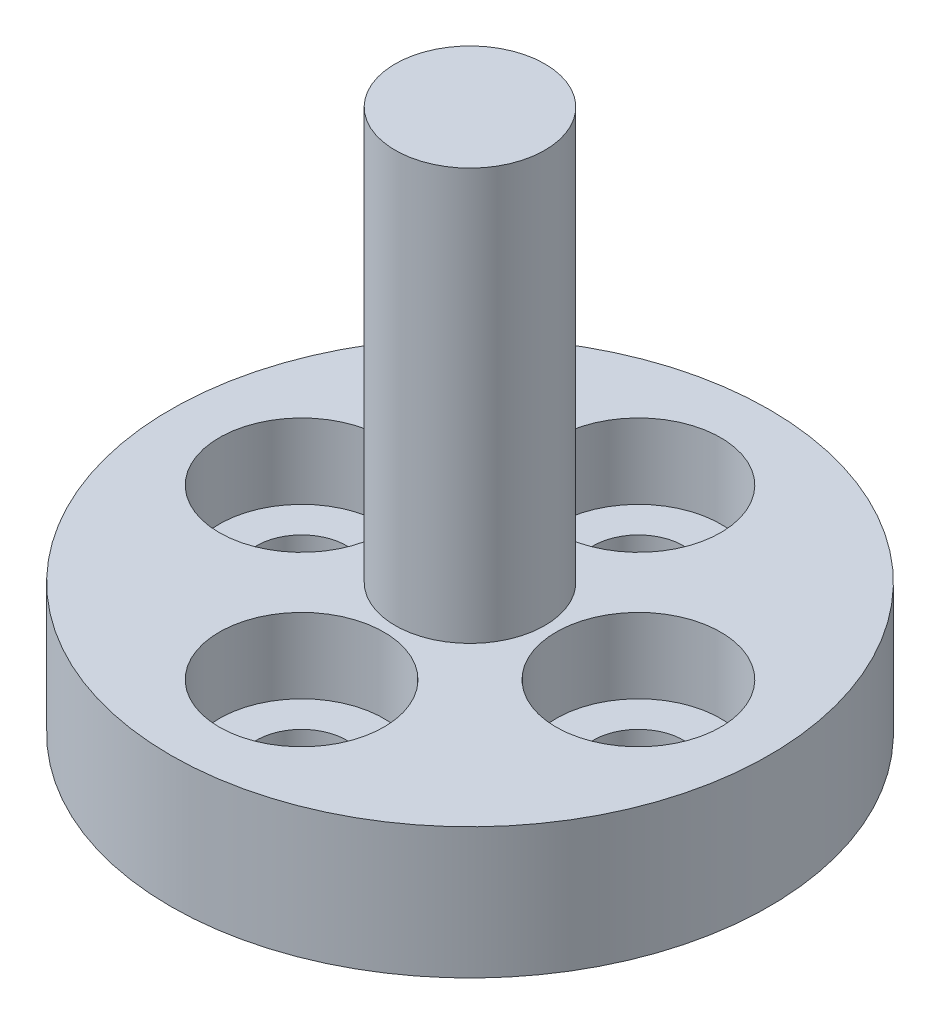
ISO-10303-21;
HEADER;
FILE_DESCRIPTION(('STEP AP214'),'2;1');
FILE_NAME('part.step','',(''),(''),'','','');
FILE_SCHEMA(('AUTOMOTIVE_DESIGN { 1 0 10303 214 1 1 1 1 }'));
ENDSEC;
DATA;
#1=APPLICATION_CONTEXT('core data for automotive mechanical design processes');
#2=APPLICATION_PROTOCOL_DEFINITION('international standard','automotive_design',2000,#1);
#3=PRODUCT_CONTEXT('',#1,'mechanical');
#4=PRODUCT('Part','Part','',(#3));
#5=PRODUCT_RELATED_PRODUCT_CATEGORY('part','',(#4));
#6=PRODUCT_DEFINITION_FORMATION('','',#4);
#7=PRODUCT_DEFINITION_CONTEXT('part definition',#1,'design');
#8=PRODUCT_DEFINITION('design','',#6,#7);
#9=PRODUCT_DEFINITION_SHAPE('','',#8);
#10=(LENGTH_UNIT() NAMED_UNIT(*) SI_UNIT(.MILLI.,.METRE.));
#11=(NAMED_UNIT(*) PLANE_ANGLE_UNIT() SI_UNIT($,.RADIAN.));
#12=(NAMED_UNIT(*) SI_UNIT($,.STERADIAN.) SOLID_ANGLE_UNIT());
#13=UNCERTAINTY_MEASURE_WITH_UNIT(LENGTH_MEASURE(1.E-05),#10,'distance_accuracy_value','');
#14=(GEOMETRIC_REPRESENTATION_CONTEXT(3) GLOBAL_UNCERTAINTY_ASSIGNED_CONTEXT((#13)) GLOBAL_UNIT_ASSIGNED_CONTEXT((#10,
#11,#12)) REPRESENTATION_CONTEXT('',''));
#15=CARTESIAN_POINT('',(0.,0.,0.));
#16=DIRECTION('',(0.,0.,1.));
#17=DIRECTION('',(1.,0.,0.));
#18=AXIS2_PLACEMENT_3D('',#15,#16,#17);
#19=CARTESIAN_POINT('',(8.,0.,0.));
#20=DIRECTION('',(0.,-1.,0.));
#21=DIRECTION('',(0.,0.,-1.));
#22=AXIS2_PLACEMENT_3D('',#19,#20,#21);
#23=PLANE('',#22);
#24=CARTESIAN_POINT('',(0.,0.,4.5));
#25=DIRECTION('',(0.,-1.,0.));
#26=DIRECTION('',(0.,0.,-1.));
#27=AXIS2_PLACEMENT_3D('',#24,#25,#26);
#28=CIRCLE('',#27,1.2);
#29=CARTESIAN_POINT('',(0.,0.,3.3));
#30=VERTEX_POINT('',#29);
#31=EDGE_CURVE('E39',#30,#30,#28,.T.);
#32=ORIENTED_EDGE('',*,*,#31,.F.);
#33=EDGE_LOOP('',(#32));
#34=FACE_BOUND('',#33,.T.);
#35=CARTESIAN_POINT('',(4.5,0.,0.));
#36=DIRECTION('',(0.,-1.,0.));
#37=DIRECTION('',(0.,0.,-1.));
#38=AXIS2_PLACEMENT_3D('',#35,#36,#37);
#39=CIRCLE('',#38,1.2);
#40=CARTESIAN_POINT('',(4.5,0.,-1.2));
#41=VERTEX_POINT('',#40);
#42=EDGE_CURVE('E65',#41,#41,#39,.T.);
#43=ORIENTED_EDGE('',*,*,#42,.F.);
#44=EDGE_LOOP('',(#43));
#45=FACE_BOUND('',#44,.T.);
#46=CARTESIAN_POINT('',(0.,0.,-4.5));
#47=DIRECTION('',(0.,-1.,0.));
#48=DIRECTION('',(0.,0.,-1.));
#49=AXIS2_PLACEMENT_3D('',#46,#47,#48);
#50=CIRCLE('',#49,1.2);
#51=CARTESIAN_POINT('',(0.,0.,-5.7));
#52=VERTEX_POINT('',#51);
#53=EDGE_CURVE('E60',#52,#52,#50,.T.);
#54=ORIENTED_EDGE('',*,*,#53,.F.);
#55=EDGE_LOOP('',(#54));
#56=FACE_BOUND('',#55,.T.);
#57=CARTESIAN_POINT('',(-4.5,0.,0.));
#58=DIRECTION('',(0.,-1.,0.));
#59=DIRECTION('',(0.,0.,-1.));
#60=AXIS2_PLACEMENT_3D('',#57,#58,#59);
#61=CIRCLE('',#60,1.2);
#62=CARTESIAN_POINT('',(-4.5,0.,-1.2));
#63=VERTEX_POINT('',#62);
#64=EDGE_CURVE('E54',#63,#63,#61,.T.);
#65=ORIENTED_EDGE('',*,*,#64,.F.);
#66=EDGE_LOOP('',(#65));
#67=FACE_BOUND('',#66,.T.);
#68=CARTESIAN_POINT('',(0.,0.,0.));
#69=DIRECTION('',(0.,-1.,0.));
#70=DIRECTION('',(0.,0.,-1.));
#71=AXIS2_PLACEMENT_3D('',#68,#69,#70);
#72=CIRCLE('',#71,8.);
#73=CARTESIAN_POINT('',(0.,0.,-8.));
#74=VERTEX_POINT('',#73);
#75=EDGE_CURVE('E58',#74,#74,#72,.T.);
#76=ORIENTED_EDGE('',*,*,#75,.T.);
#77=EDGE_LOOP('',(#76));
#78=FACE_BOUND('',#77,.T.);
#79=ADVANCED_FACE('F36',(#34,#45,#56,#67,#78),#23,.T.);
#80=CARTESIAN_POINT('',(0.,14.5,0.));
#81=DIRECTION('',(0.,1.,0.));
#82=DIRECTION('',(0.,0.,1.));
#83=AXIS2_PLACEMENT_3D('',#80,#81,#82);
#84=PLANE('',#83);
#85=CARTESIAN_POINT('',(0.,14.5,0.));
#86=DIRECTION('',(0.,-1.,0.));
#87=DIRECTION('',(0.,0.,-1.));
#88=AXIS2_PLACEMENT_3D('',#85,#86,#87);
#89=CIRCLE('',#88,2.);
#90=CARTESIAN_POINT('',(0.,14.5,-2.));
#91=VERTEX_POINT('',#90);
#92=EDGE_CURVE('E10',#91,#91,#89,.T.);
#93=ORIENTED_EDGE('',*,*,#92,.F.);
#94=EDGE_LOOP('',(#93));
#95=FACE_BOUND('',#94,.T.);
#96=ADVANCED_FACE('F124',(#95),#84,.T.);
#97=CARTESIAN_POINT('',(0.,0.,0.));
#98=DIRECTION('',(0.,-1.,0.));
#99=DIRECTION('',(0.,0.,-1.));
#100=AXIS2_PLACEMENT_3D('',#97,#98,#99);
#101=CYLINDRICAL_SURFACE('',#100,2.);
#102=ORIENTED_EDGE('',*,*,#92,.T.);
#103=EDGE_LOOP('',(#102));
#104=FACE_BOUND('',#103,.T.);
#105=CARTESIAN_POINT('',(0.,3.5,0.));
#106=DIRECTION('',(0.,-1.,0.));
#107=DIRECTION('',(0.,0.,-1.));
#108=AXIS2_PLACEMENT_3D('',#105,#106,#107);
#109=CIRCLE('',#108,2.);
#110=CARTESIAN_POINT('',(0.,3.5,-2.));
#111=VERTEX_POINT('',#110);
#112=EDGE_CURVE('E44',#111,#111,#109,.T.);
#113=ORIENTED_EDGE('',*,*,#112,.F.);
#114=EDGE_LOOP('',(#113));
#115=FACE_BOUND('',#114,.T.);
#116=ADVANCED_FACE('F115',(#104,#115),#101,.T.);
#117=CARTESIAN_POINT('',(2.,3.5,0.));
#118=DIRECTION('',(0.,1.,0.));
#119=DIRECTION('',(0.,0.,1.));
#120=AXIS2_PLACEMENT_3D('',#117,#118,#119);
#121=PLANE('',#120);
#122=CARTESIAN_POINT('',(0.,3.5,4.5));
#123=DIRECTION('',(0.,1.,0.));
#124=DIRECTION('',(0.,0.,1.));
#125=AXIS2_PLACEMENT_3D('',#122,#123,#124);
#126=CIRCLE('',#125,2.2);
#127=CARTESIAN_POINT('',(0.,3.5,6.7));
#128=VERTEX_POINT('',#127);
#129=EDGE_CURVE('E208',#128,#128,#126,.T.);
#130=ORIENTED_EDGE('',*,*,#129,.F.);
#131=EDGE_LOOP('',(#130));
#132=FACE_BOUND('',#131,.T.);
#133=CARTESIAN_POINT('',(4.5,3.5,0.));
#134=DIRECTION('',(0.,1.,0.));
#135=DIRECTION('',(0.,0.,1.));
#136=AXIS2_PLACEMENT_3D('',#133,#134,#135);
#137=CIRCLE('',#136,2.2);
#138=CARTESIAN_POINT('',(4.5,3.5,2.2));
#139=VERTEX_POINT('',#138);
#140=EDGE_CURVE('E84',#139,#139,#137,.T.);
#141=ORIENTED_EDGE('',*,*,#140,.F.);
#142=EDGE_LOOP('',(#141));
#143=FACE_BOUND('',#142,.T.);
#144=CARTESIAN_POINT('',(0.,3.5,-4.5));
#145=DIRECTION('',(0.,1.,0.));
#146=DIRECTION('',(0.,0.,1.));
#147=AXIS2_PLACEMENT_3D('',#144,#145,#146);
#148=CIRCLE('',#147,2.2);
#149=CARTESIAN_POINT('',(0.,3.5,-2.3));
#150=VERTEX_POINT('',#149);
#151=EDGE_CURVE('E68',#150,#150,#148,.T.);
#152=ORIENTED_EDGE('',*,*,#151,.F.);
#153=EDGE_LOOP('',(#152));
#154=FACE_BOUND('',#153,.T.);
#155=CARTESIAN_POINT('',(-4.5,3.5,0.));
#156=DIRECTION('',(0.,1.,0.));
#157=DIRECTION('',(0.,0.,1.));
#158=AXIS2_PLACEMENT_3D('',#155,#156,#157);
#159=CIRCLE('',#158,2.2);
#160=CARTESIAN_POINT('',(-4.5,3.5,2.2));
#161=VERTEX_POINT('',#160);
#162=EDGE_CURVE('E63',#161,#161,#159,.T.);
#163=ORIENTED_EDGE('',*,*,#162,.F.);
#164=EDGE_LOOP('',(#163));
#165=FACE_BOUND('',#164,.T.);
#166=ORIENTED_EDGE('',*,*,#112,.T.);
#167=EDGE_LOOP('',(#166));
#168=FACE_BOUND('',#167,.T.);
#169=CARTESIAN_POINT('',(0.,3.5,0.));
#170=DIRECTION('',(0.,-1.,0.));
#171=DIRECTION('',(0.,0.,-1.));
#172=AXIS2_PLACEMENT_3D('',#169,#170,#171);
#173=CIRCLE('',#172,8.);
#174=CARTESIAN_POINT('',(0.,3.5,-8.));
#175=VERTEX_POINT('',#174);
#176=EDGE_CURVE('E50',#175,#175,#173,.T.);
#177=ORIENTED_EDGE('',*,*,#176,.F.);
#178=EDGE_LOOP('',(#177));
#179=FACE_BOUND('',#178,.T.);
#180=ADVANCED_FACE('F113',(#132,#143,#154,#165,#168,#179),#121,.T.);
#181=CARTESIAN_POINT('',(0.,0.,0.));
#182=DIRECTION('',(0.,-1.,0.));
#183=DIRECTION('',(0.,0.,-1.));
#184=AXIS2_PLACEMENT_3D('',#181,#182,#183);
#185=CYLINDRICAL_SURFACE('',#184,8.);
#186=ORIENTED_EDGE('',*,*,#176,.T.);
#187=EDGE_LOOP('',(#186));
#188=FACE_BOUND('',#187,.T.);
#189=ORIENTED_EDGE('',*,*,#75,.F.);
#190=EDGE_LOOP('',(#189));
#191=FACE_BOUND('',#190,.T.);
#192=ADVANCED_FACE('F110',(#188,#191),#185,.T.);
#193=CARTESIAN_POINT('',(-4.5,3.5,0.));
#194=DIRECTION('',(0.,1.,0.));
#195=DIRECTION('',(0.,0.,1.));
#196=AXIS2_PLACEMENT_3D('',#193,#194,#195);
#197=CYLINDRICAL_SURFACE('',#196,1.2);
#198=ORIENTED_EDGE('',*,*,#64,.T.);
#199=EDGE_LOOP('',(#198));
#200=FACE_BOUND('',#199,.T.);
#201=CARTESIAN_POINT('',(-4.5,1.5,0.));
#202=DIRECTION('',(0.,1.,0.));
#203=DIRECTION('',(0.,0.,1.));
#204=AXIS2_PLACEMENT_3D('',#201,#202,#203);
#205=CIRCLE('',#204,1.2);
#206=CARTESIAN_POINT('',(-4.5,1.5,1.2));
#207=VERTEX_POINT('',#206);
#208=EDGE_CURVE('E59',#207,#207,#205,.T.);
#209=ORIENTED_EDGE('',*,*,#208,.T.);
#210=EDGE_LOOP('',(#209));
#211=FACE_BOUND('',#210,.T.);
#212=ADVANCED_FACE('F122',(#200,#211),#197,.F.);
#213=CARTESIAN_POINT('',(-3.3,1.5,0.));
#214=DIRECTION('',(0.,-1.,0.));
#215=DIRECTION('',(0.,0.,-1.));
#216=AXIS2_PLACEMENT_3D('',#213,#214,#215);
#217=PLANE('',#216);
#218=ORIENTED_EDGE('',*,*,#208,.F.);
#219=EDGE_LOOP('',(#218));
#220=FACE_BOUND('',#219,.T.);
#221=CARTESIAN_POINT('',(-4.5,1.5,0.));
#222=DIRECTION('',(0.,1.,0.));
#223=DIRECTION('',(0.,0.,1.));
#224=AXIS2_PLACEMENT_3D('',#221,#222,#223);
#225=CIRCLE('',#224,2.2);
#226=CARTESIAN_POINT('',(-4.5,1.5,2.2));
#227=VERTEX_POINT('',#226);
#228=EDGE_CURVE('E97',#227,#227,#225,.T.);
#229=ORIENTED_EDGE('',*,*,#228,.T.);
#230=EDGE_LOOP('',(#229));
#231=FACE_BOUND('',#230,.T.);
#232=ADVANCED_FACE('F146',(#220,#231),#217,.F.);
#233=CARTESIAN_POINT('',(-4.5,3.5,0.));
#234=DIRECTION('',(0.,1.,0.));
#235=DIRECTION('',(0.,0.,1.));
#236=AXIS2_PLACEMENT_3D('',#233,#234,#235);
#237=CYLINDRICAL_SURFACE('',#236,2.2);
#238=ORIENTED_EDGE('',*,*,#228,.F.);
#239=EDGE_LOOP('',(#238));
#240=FACE_BOUND('',#239,.T.);
#241=ORIENTED_EDGE('',*,*,#162,.T.);
#242=EDGE_LOOP('',(#241));
#243=FACE_BOUND('',#242,.T.);
#244=ADVANCED_FACE('F152',(#240,#243),#237,.F.);
#245=CARTESIAN_POINT('',(0.,3.5,-4.5));
#246=DIRECTION('',(0.,1.,0.));
#247=DIRECTION('',(0.,0.,1.));
#248=AXIS2_PLACEMENT_3D('',#245,#246,#247);
#249=CYLINDRICAL_SURFACE('',#248,1.2);
#250=ORIENTED_EDGE('',*,*,#53,.T.);
#251=EDGE_LOOP('',(#250));
#252=FACE_BOUND('',#251,.T.);
#253=CARTESIAN_POINT('',(0.,1.5,-4.5));
#254=DIRECTION('',(0.,1.,0.));
#255=DIRECTION('',(0.,0.,1.));
#256=AXIS2_PLACEMENT_3D('',#253,#254,#255);
#257=CIRCLE('',#256,1.2);
#258=CARTESIAN_POINT('',(0.,1.5,-3.3));
#259=VERTEX_POINT('',#258);
#260=EDGE_CURVE('E64',#259,#259,#257,.T.);
#261=ORIENTED_EDGE('',*,*,#260,.T.);
#262=EDGE_LOOP('',(#261));
#263=FACE_BOUND('',#262,.T.);
#264=ADVANCED_FACE('F158',(#252,#263),#249,.F.);
#265=CARTESIAN_POINT('',(1.2,1.5,-4.5));
#266=DIRECTION('',(0.,-1.,0.));
#267=DIRECTION('',(0.,0.,-1.));
#268=AXIS2_PLACEMENT_3D('',#265,#266,#267);
#269=PLANE('',#268);
#270=ORIENTED_EDGE('',*,*,#260,.F.);
#271=EDGE_LOOP('',(#270));
#272=FACE_BOUND('',#271,.T.);
#273=CARTESIAN_POINT('',(0.,1.5,-4.5));
#274=DIRECTION('',(0.,1.,0.));
#275=DIRECTION('',(0.,0.,1.));
#276=AXIS2_PLACEMENT_3D('',#273,#274,#275);
#277=CIRCLE('',#276,2.2);
#278=CARTESIAN_POINT('',(0.,1.5,-2.3));
#279=VERTEX_POINT('',#278);
#280=EDGE_CURVE('E75',#279,#279,#277,.T.);
#281=ORIENTED_EDGE('',*,*,#280,.T.);
#282=EDGE_LOOP('',(#281));
#283=FACE_BOUND('',#282,.T.);
#284=ADVANCED_FACE('F168',(#272,#283),#269,.F.);
#285=CARTESIAN_POINT('',(0.,3.5,-4.5));
#286=DIRECTION('',(0.,1.,0.));
#287=DIRECTION('',(0.,0.,1.));
#288=AXIS2_PLACEMENT_3D('',#285,#286,#287);
#289=CYLINDRICAL_SURFACE('',#288,2.2);
#290=ORIENTED_EDGE('',*,*,#280,.F.);
#291=EDGE_LOOP('',(#290));
#292=FACE_BOUND('',#291,.T.);
#293=ORIENTED_EDGE('',*,*,#151,.T.);
#294=EDGE_LOOP('',(#293));
#295=FACE_BOUND('',#294,.T.);
#296=ADVANCED_FACE('F174',(#292,#295),#289,.F.);
#297=CARTESIAN_POINT('',(4.5,3.5,0.));
#298=DIRECTION('',(0.,1.,0.));
#299=DIRECTION('',(0.,0.,1.));
#300=AXIS2_PLACEMENT_3D('',#297,#298,#299);
#301=CYLINDRICAL_SURFACE('',#300,1.2);
#302=ORIENTED_EDGE('',*,*,#42,.T.);
#303=EDGE_LOOP('',(#302));
#304=FACE_BOUND('',#303,.T.);
#305=CARTESIAN_POINT('',(4.5,1.5,0.));
#306=DIRECTION('',(0.,1.,0.));
#307=DIRECTION('',(0.,0.,1.));
#308=AXIS2_PLACEMENT_3D('',#305,#306,#307);
#309=CIRCLE('',#308,1.2);
#310=CARTESIAN_POINT('',(4.5,1.5,1.2));
#311=VERTEX_POINT('',#310);
#312=EDGE_CURVE('E69',#311,#311,#309,.T.);
#313=ORIENTED_EDGE('',*,*,#312,.T.);
#314=EDGE_LOOP('',(#313));
#315=FACE_BOUND('',#314,.T.);
#316=ADVANCED_FACE('F178',(#304,#315),#301,.F.);
#317=CARTESIAN_POINT('',(5.7,1.5,0.));
#318=DIRECTION('',(0.,-1.,0.));
#319=DIRECTION('',(0.,0.,-1.));
#320=AXIS2_PLACEMENT_3D('',#317,#318,#319);
#321=PLANE('',#320);
#322=ORIENTED_EDGE('',*,*,#312,.F.);
#323=EDGE_LOOP('',(#322));
#324=FACE_BOUND('',#323,.T.);
#325=CARTESIAN_POINT('',(4.5,1.5,0.));
#326=DIRECTION('',(0.,1.,0.));
#327=DIRECTION('',(0.,0.,1.));
#328=AXIS2_PLACEMENT_3D('',#325,#326,#327);
#329=CIRCLE('',#328,2.2);
#330=CARTESIAN_POINT('',(4.5,1.5,2.2));
#331=VERTEX_POINT('',#330);
#332=EDGE_CURVE('E78',#331,#331,#329,.T.);
#333=ORIENTED_EDGE('',*,*,#332,.T.);
#334=EDGE_LOOP('',(#333));
#335=FACE_BOUND('',#334,.T.);
#336=ADVANCED_FACE('F182',(#324,#335),#321,.F.);
#337=CARTESIAN_POINT('',(4.5,3.5,0.));
#338=DIRECTION('',(0.,1.,0.));
#339=DIRECTION('',(0.,0.,1.));
#340=AXIS2_PLACEMENT_3D('',#337,#338,#339);
#341=CYLINDRICAL_SURFACE('',#340,2.2);
#342=ORIENTED_EDGE('',*,*,#332,.F.);
#343=EDGE_LOOP('',(#342));
#344=FACE_BOUND('',#343,.T.);
#345=ORIENTED_EDGE('',*,*,#140,.T.);
#346=EDGE_LOOP('',(#345));
#347=FACE_BOUND('',#346,.T.);
#348=ADVANCED_FACE('F185',(#344,#347),#341,.F.);
#349=CARTESIAN_POINT('',(0.,3.5,4.5));
#350=DIRECTION('',(0.,1.,0.));
#351=DIRECTION('',(0.,0.,1.));
#352=AXIS2_PLACEMENT_3D('',#349,#350,#351);
#353=CYLINDRICAL_SURFACE('',#352,1.2);
#354=ORIENTED_EDGE('',*,*,#31,.T.);
#355=EDGE_LOOP('',(#354));
#356=FACE_BOUND('',#355,.T.);
#357=CARTESIAN_POINT('',(0.,1.5,4.5));
#358=DIRECTION('',(0.,1.,0.));
#359=DIRECTION('',(0.,0.,1.));
#360=AXIS2_PLACEMENT_3D('',#357,#358,#359);
#361=CIRCLE('',#360,1.2);
#362=CARTESIAN_POINT('',(0.,1.5,5.7));
#363=VERTEX_POINT('',#362);
#364=EDGE_CURVE('E212',#363,#363,#361,.T.);
#365=ORIENTED_EDGE('',*,*,#364,.T.);
#366=EDGE_LOOP('',(#365));
#367=FACE_BOUND('',#366,.T.);
#368=ADVANCED_FACE('F189',(#356,#367),#353,.F.);
#369=CARTESIAN_POINT('',(1.2,1.5,4.5));
#370=DIRECTION('',(0.,-1.,0.));
#371=DIRECTION('',(0.,0.,-1.));
#372=AXIS2_PLACEMENT_3D('',#369,#370,#371);
#373=PLANE('',#372);
#374=ORIENTED_EDGE('',*,*,#364,.F.);
#375=EDGE_LOOP('',(#374));
#376=FACE_BOUND('',#375,.T.);
#377=CARTESIAN_POINT('',(0.,1.5,4.5));
#378=DIRECTION('',(0.,1.,0.));
#379=DIRECTION('',(0.,0.,1.));
#380=AXIS2_PLACEMENT_3D('',#377,#378,#379);
#381=CIRCLE('',#380,2.2);
#382=CARTESIAN_POINT('',(0.,1.5,6.7));
#383=VERTEX_POINT('',#382);
#384=EDGE_CURVE('E206',#383,#383,#381,.T.);
#385=ORIENTED_EDGE('',*,*,#384,.T.);
#386=EDGE_LOOP('',(#385));
#387=FACE_BOUND('',#386,.T.);
#388=ADVANCED_FACE('F193',(#376,#387),#373,.F.);
#389=CARTESIAN_POINT('',(0.,3.5,4.5));
#390=DIRECTION('',(0.,1.,0.));
#391=DIRECTION('',(0.,0.,1.));
#392=AXIS2_PLACEMENT_3D('',#389,#390,#391);
#393=CYLINDRICAL_SURFACE('',#392,2.2);
#394=ORIENTED_EDGE('',*,*,#384,.F.);
#395=EDGE_LOOP('',(#394));
#396=FACE_BOUND('',#395,.T.);
#397=ORIENTED_EDGE('',*,*,#129,.T.);
#398=EDGE_LOOP('',(#397));
#399=FACE_BOUND('',#398,.T.);
#400=ADVANCED_FACE('F197',(#396,#399),#393,.F.);
#401=CLOSED_SHELL('',(#79,#96,#116,#180,#192,#212,#232,#244,#264,#284,#296,#316,#336,#348,#368,
#388,#400));
#402=MANIFOLD_SOLID_BREP('B2',#401);
#403=ADVANCED_BREP_SHAPE_REPRESENTATION('',(#18,#402),#14);
#404=SHAPE_DEFINITION_REPRESENTATION(#9,#403);
ENDSEC;
END-ISO-10303-21;
